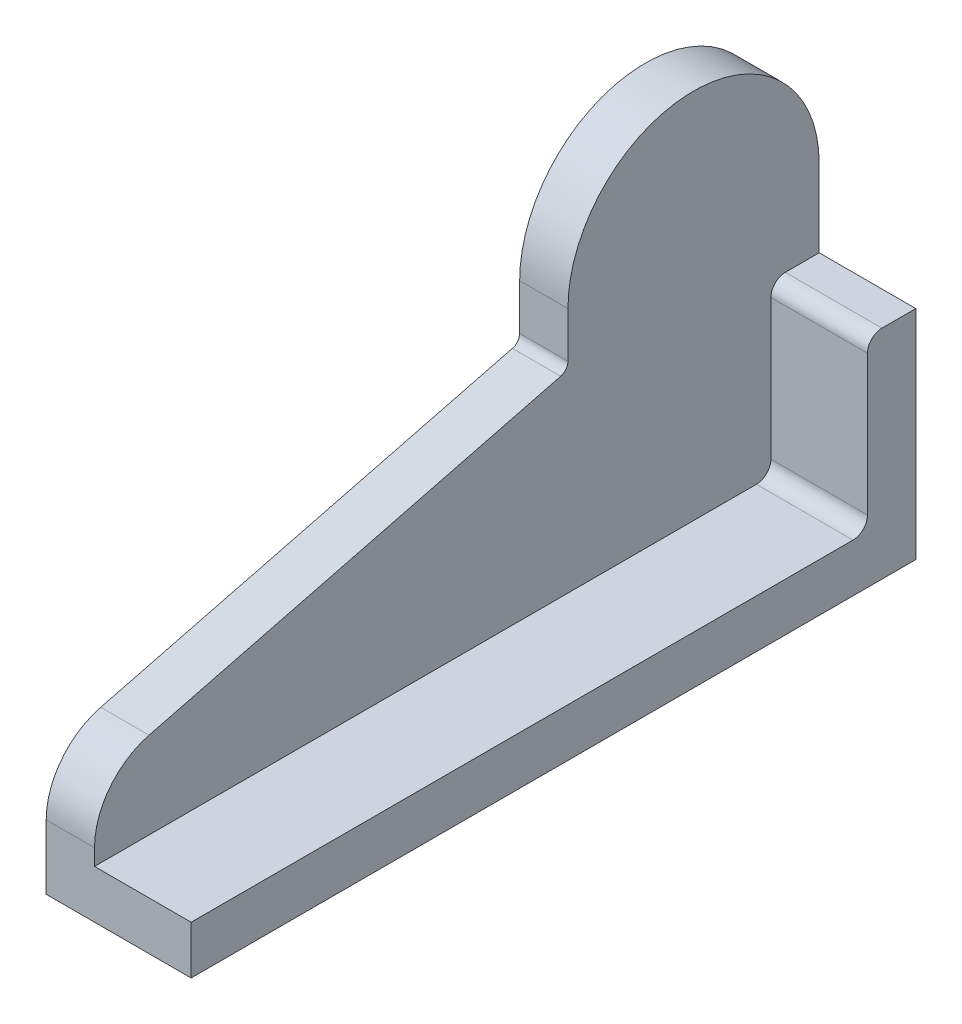
ISO-10303-21;
HEADER;
FILE_DESCRIPTION(('STEP AP214'),'2;1');
FILE_NAME('part.step','',(''),(''),'','','');
FILE_SCHEMA(('AUTOMOTIVE_DESIGN { 1 0 10303 214 1 1 1 1 }'));
ENDSEC;
DATA;
#1=APPLICATION_CONTEXT('core data for automotive mechanical design processes');
#2=APPLICATION_PROTOCOL_DEFINITION('international standard','automotive_design',2000,#1);
#3=PRODUCT_CONTEXT('',#1,'mechanical');
#4=PRODUCT('Part','Part','',(#3));
#5=PRODUCT_RELATED_PRODUCT_CATEGORY('part','',(#4));
#6=PRODUCT_DEFINITION_FORMATION('','',#4);
#7=PRODUCT_DEFINITION_CONTEXT('part definition',#1,'design');
#8=PRODUCT_DEFINITION('design','',#6,#7);
#9=PRODUCT_DEFINITION_SHAPE('','',#8);
#10=(LENGTH_UNIT() NAMED_UNIT(*) SI_UNIT(.MILLI.,.METRE.));
#11=(NAMED_UNIT(*) PLANE_ANGLE_UNIT() SI_UNIT($,.RADIAN.));
#12=(NAMED_UNIT(*) SI_UNIT($,.STERADIAN.) SOLID_ANGLE_UNIT());
#13=UNCERTAINTY_MEASURE_WITH_UNIT(LENGTH_MEASURE(1.E-05),#10,'distance_accuracy_value','');
#14=(GEOMETRIC_REPRESENTATION_CONTEXT(3) GLOBAL_UNCERTAINTY_ASSIGNED_CONTEXT((#13)) GLOBAL_UNIT_ASSIGNED_CONTEXT((#10,
#11,#12)) REPRESENTATION_CONTEXT('',''));
#15=CARTESIAN_POINT('',(0.,0.,0.));
#16=DIRECTION('',(0.,0.,1.));
#17=DIRECTION('',(1.,0.,0.));
#18=AXIS2_PLACEMENT_3D('',#15,#16,#17);
#19=CARTESIAN_POINT('',(-41.,10.,-75.));
#20=DIRECTION('',(0.,0.,1.));
#21=DIRECTION('',(1.,0.,0.));
#22=AXIS2_PLACEMENT_3D('',#19,#20,#21);
#23=PLANE('',#22);
#24=DIRECTION('',(-1.,0.,0.));
#25=VECTOR('',#24,1.);
#26=CARTESIAN_POINT('',(-41.,0.,-75.));
#27=LINE('',#26,#25);
#28=CARTESIAN_POINT('',(10.,0.,-75.));
#29=VERTEX_POINT('',#28);
#30=CARTESIAN_POINT('',(-20.,0.,-75.));
#31=VERTEX_POINT('',#30);
#32=EDGE_CURVE('E170',#29,#31,#27,.T.);
#33=ORIENTED_EDGE('',*,*,#32,.T.);
#34=DIRECTION('',(0.,-1.,0.));
#35=VECTOR('',#34,1.);
#36=CARTESIAN_POINT('',(-20.,45.,-75.));
#37=LINE('',#36,#35);
#38=CARTESIAN_POINT('',(-20.,61.,-75.));
#39=VERTEX_POINT('',#38);
#40=EDGE_CURVE('E160',#39,#31,#37,.T.);
#41=ORIENTED_EDGE('',*,*,#40,.F.);
#42=DIRECTION('',(1.,0.,0.));
#43=VECTOR('',#42,1.);
#44=CARTESIAN_POINT('',(-10.,61.,-75.));
#45=LINE('',#44,#43);
#46=CARTESIAN_POINT('',(-10.,61.,-75.));
#47=VERTEX_POINT('',#46);
#48=EDGE_CURVE('E184',#39,#47,#45,.T.);
#49=ORIENTED_EDGE('',*,*,#48,.T.);
#50=DIRECTION('',(0.,1.,0.));
#51=VECTOR('',#50,1.);
#52=CARTESIAN_POINT('',(-10.,45.,-75.));
#53=LINE('',#52,#51);
#54=CARTESIAN_POINT('',(-10.,45.,-75.));
#55=VERTEX_POINT('',#54);
#56=EDGE_CURVE('E246',#55,#47,#53,.T.);
#57=ORIENTED_EDGE('',*,*,#56,.F.);
#58=DIRECTION('',(1.,0.,0.));
#59=VECTOR('',#58,1.);
#60=CARTESIAN_POINT('',(-41.,45.,-75.));
#61=LINE('',#60,#59);
#62=CARTESIAN_POINT('',(10.,45.,-75.));
#63=VERTEX_POINT('',#62);
#64=EDGE_CURVE('E175',#55,#63,#61,.T.);
#65=ORIENTED_EDGE('',*,*,#64,.T.);
#66=DIRECTION('',(0.,-1.,0.));
#67=VECTOR('',#66,1.);
#68=CARTESIAN_POINT('',(10.,10.,-75.));
#69=LINE('',#68,#67);
#70=EDGE_CURVE('E154',#63,#29,#69,.T.);
#71=ORIENTED_EDGE('',*,*,#70,.T.);
#72=EDGE_LOOP('',(#33,#41,#49,#57,#65,#71));
#73=FACE_BOUND('',#72,.T.);
#74=ADVANCED_FACE('F43',(#73),#23,.F.);
#75=CARTESIAN_POINT('',(-41.,10.,75.));
#76=DIRECTION('',(0.,0.,-1.));
#77=DIRECTION('',(-1.,0.,0.));
#78=AXIS2_PLACEMENT_3D('',#75,#76,#77);
#79=PLANE('',#78);
#80=DIRECTION('',(0.,1.,0.));
#81=VECTOR('',#80,1.);
#82=CARTESIAN_POINT('',(-20.,25.,75.));
#83=LINE('',#82,#81);
#84=CARTESIAN_POINT('',(-20.,0.,75.));
#85=VERTEX_POINT('',#84);
#86=CARTESIAN_POINT('',(-20.,13.3461450703262,75.));
#87=VERTEX_POINT('',#86);
#88=EDGE_CURVE('E143',#85,#87,#83,.T.);
#89=ORIENTED_EDGE('',*,*,#88,.F.);
#90=DIRECTION('',(1.,0.,0.));
#91=VECTOR('',#90,1.);
#92=CARTESIAN_POINT('',(-41.,0.,75.));
#93=LINE('',#92,#91);
#94=CARTESIAN_POINT('',(10.,0.,75.));
#95=VERTEX_POINT('',#94);
#96=EDGE_CURVE('E148',#85,#95,#93,.T.);
#97=ORIENTED_EDGE('',*,*,#96,.T.);
#98=DIRECTION('',(0.,1.,0.));
#99=VECTOR('',#98,1.);
#100=CARTESIAN_POINT('',(10.,10.,75.));
#101=LINE('',#100,#99);
#102=CARTESIAN_POINT('',(10.,10.,75.));
#103=VERTEX_POINT('',#102);
#104=EDGE_CURVE('E164',#95,#103,#101,.T.);
#105=ORIENTED_EDGE('',*,*,#104,.T.);
#106=DIRECTION('',(1.,0.,0.));
#107=VECTOR('',#106,1.);
#108=CARTESIAN_POINT('',(-41.,10.,75.));
#109=LINE('',#108,#107);
#110=CARTESIAN_POINT('',(-9.99999999999998,10.,75.));
#111=VERTEX_POINT('',#110);
#112=EDGE_CURVE('E169',#111,#103,#109,.T.);
#113=ORIENTED_EDGE('',*,*,#112,.F.);
#114=DIRECTION('',(0.,1.,0.));
#115=VECTOR('',#114,1.);
#116=CARTESIAN_POINT('',(-10.,25.,75.));
#117=LINE('',#116,#115);
#118=CARTESIAN_POINT('',(-10.,13.3461450703262,75.));
#119=VERTEX_POINT('',#118);
#120=EDGE_CURVE('E232',#111,#119,#117,.T.);
#121=ORIENTED_EDGE('',*,*,#120,.T.);
#122=DIRECTION('',(-1.,0.,0.));
#123=VECTOR('',#122,1.);
#124=CARTESIAN_POINT('',(-20.,13.3461450703262,75.));
#125=LINE('',#124,#123);
#126=EDGE_CURVE('E152',#119,#87,#125,.T.);
#127=ORIENTED_EDGE('',*,*,#126,.T.);
#128=EDGE_LOOP('',(#89,#97,#105,#113,#121,#127));
#129=FACE_BOUND('',#128,.T.);
#130=ADVANCED_FACE('F145',(#129),#79,.F.);
#131=CARTESIAN_POINT('',(0.,0.,0.));
#132=DIRECTION('',(0.,-1.,0.));
#133=DIRECTION('',(0.,0.,-1.));
#134=AXIS2_PLACEMENT_3D('',#131,#132,#133);
#135=PLANE('',#134);
#136=ORIENTED_EDGE('',*,*,#96,.F.);
#137=DIRECTION('',(0.,0.,-1.));
#138=VECTOR('',#137,1.);
#139=CARTESIAN_POINT('',(-20.,0.,0.));
#140=LINE('',#139,#138);
#141=EDGE_CURVE('E157',#85,#31,#140,.T.);
#142=ORIENTED_EDGE('',*,*,#141,.T.);
#143=ORIENTED_EDGE('',*,*,#32,.F.);
#144=DIRECTION('',(0.,0.,-1.));
#145=VECTOR('',#144,1.);
#146=CARTESIAN_POINT('',(10.,0.,0.));
#147=LINE('',#146,#145);
#148=EDGE_CURVE('E168',#95,#29,#147,.T.);
#149=ORIENTED_EDGE('',*,*,#148,.F.);
#150=EDGE_LOOP('',(#136,#142,#143,#149));
#151=FACE_BOUND('',#150,.T.);
#152=ADVANCED_FACE('F167',(#151),#135,.T.);
#153=CARTESIAN_POINT('',(0.,10.,0.));
#154=DIRECTION('',(0.,-1.,0.));
#155=DIRECTION('',(0.,0.,-1.));
#156=AXIS2_PLACEMENT_3D('',#153,#154,#155);
#157=PLANE('',#156);
#158=DIRECTION('',(0.,0.,1.));
#159=VECTOR('',#158,1.);
#160=CARTESIAN_POINT('',(10.,10.,-75.));
#161=LINE('',#160,#159);
#162=CARTESIAN_POINT('',(10.,10.,-62.));
#163=VERTEX_POINT('',#162);
#164=EDGE_CURVE('E240',#163,#103,#161,.T.);
#165=ORIENTED_EDGE('',*,*,#164,.F.);
#166=DIRECTION('',(-1.,0.,0.));
#167=VECTOR('',#166,1.);
#168=CARTESIAN_POINT('',(0.,10.,-62.));
#169=LINE('',#168,#167);
#170=CARTESIAN_POINT('',(-10.,10.,-62.));
#171=VERTEX_POINT('',#170);
#172=EDGE_CURVE('E209',#163,#171,#169,.T.);
#173=ORIENTED_EDGE('',*,*,#172,.T.);
#174=DIRECTION('',(0.,0.,1.));
#175=VECTOR('',#174,1.);
#176=CARTESIAN_POINT('',(-10.,10.,-75.));
#177=LINE('',#176,#175);
#178=EDGE_CURVE('E238',#171,#111,#177,.T.);
#179=ORIENTED_EDGE('',*,*,#178,.T.);
#180=ORIENTED_EDGE('',*,*,#112,.T.);
#181=EDGE_LOOP('',(#165,#173,#179,#180));
#182=FACE_BOUND('',#181,.T.);
#183=ADVANCED_FACE('F282',(#182),#157,.F.);
#184=CARTESIAN_POINT('',(-10.,61.,-49.));
#185=DIRECTION('',(-1.,0.,0.));
#186=DIRECTION('',(0.,0.,1.));
#187=AXIS2_PLACEMENT_3D('',#184,#185,#186);
#188=CYLINDRICAL_SURFACE('',#187,26.);
#189=DIRECTION('',(1.,0.,0.));
#190=VECTOR('',#189,1.);
#191=CARTESIAN_POINT('',(-10.,61.,-23.));
#192=LINE('',#191,#190);
#193=CARTESIAN_POINT('',(-10.,61.,-23.));
#194=VERTEX_POINT('',#193);
#195=CARTESIAN_POINT('',(-20.,61.,-23.));
#196=VERTEX_POINT('',#195);
#197=EDGE_CURVE('E181',#194,#196,#192,.F.);
#198=ORIENTED_EDGE('',*,*,#197,.F.);
#199=CARTESIAN_POINT('',(-10.,61.,-49.));
#200=DIRECTION('',(1.,0.,0.));
#201=DIRECTION('',(0.,1.,0.));
#202=AXIS2_PLACEMENT_3D('',#199,#200,#201);
#203=CIRCLE('',#202,26.);
#204=EDGE_CURVE('E187',#47,#194,#203,.T.);
#205=ORIENTED_EDGE('',*,*,#204,.F.);
#206=ORIENTED_EDGE('',*,*,#48,.F.);
#207=CARTESIAN_POINT('',(-20.,61.,-49.));
#208=DIRECTION('',(-1.,0.,0.));
#209=DIRECTION('',(0.,-1.,0.));
#210=AXIS2_PLACEMENT_3D('',#207,#208,#209);
#211=CIRCLE('',#210,26.);
#212=EDGE_CURVE('E190',#196,#39,#211,.T.);
#213=ORIENTED_EDGE('',*,*,#212,.F.);
#214=EDGE_LOOP('',(#198,#205,#206,#213));
#215=FACE_BOUND('',#214,.T.);
#216=ADVANCED_FACE('F310',(#215),#188,.T.);
#217=CARTESIAN_POINT('',(-41.,0.,-65.));
#218=DIRECTION('',(0.,0.,1.));
#219=DIRECTION('',(1.,0.,0.));
#220=AXIS2_PLACEMENT_3D('',#217,#218,#219);
#221=PLANE('',#220);
#222=DIRECTION('',(0.,1.,0.));
#223=VECTOR('',#222,1.);
#224=CARTESIAN_POINT('',(-10.,0.,-65.));
#225=LINE('',#224,#223);
#226=CARTESIAN_POINT('',(-10.,13.,-65.));
#227=VERTEX_POINT('',#226);
#228=CARTESIAN_POINT('',(-10.,42.,-65.));
#229=VERTEX_POINT('',#228);
#230=EDGE_CURVE('E242',#227,#229,#225,.T.);
#231=ORIENTED_EDGE('',*,*,#230,.F.);
#232=DIRECTION('',(-1.,0.,0.));
#233=VECTOR('',#232,1.);
#234=CARTESIAN_POINT('',(-41.,13.,-65.));
#235=LINE('',#234,#233);
#236=CARTESIAN_POINT('',(10.,13.,-65.));
#237=VERTEX_POINT('',#236);
#238=EDGE_CURVE('E214',#227,#237,#235,.F.);
#239=ORIENTED_EDGE('',*,*,#238,.T.);
#240=DIRECTION('',(0.,-1.,0.));
#241=VECTOR('',#240,1.);
#242=CARTESIAN_POINT('',(10.,0.,-65.));
#243=LINE('',#242,#241);
#244=CARTESIAN_POINT('',(10.,42.,-65.));
#245=VERTEX_POINT('',#244);
#246=EDGE_CURVE('E253',#245,#237,#243,.T.);
#247=ORIENTED_EDGE('',*,*,#246,.F.);
#248=DIRECTION('',(1.,0.,0.));
#249=VECTOR('',#248,1.);
#250=CARTESIAN_POINT('',(-41.,42.,-65.));
#251=LINE('',#250,#249);
#252=EDGE_CURVE('E202',#245,#229,#251,.F.);
#253=ORIENTED_EDGE('',*,*,#252,.T.);
#254=EDGE_LOOP('',(#231,#239,#247,#253));
#255=FACE_BOUND('',#254,.T.);
#256=ADVANCED_FACE('F275',(#255),#221,.T.);
#257=CARTESIAN_POINT('',(-41.,45.,-75.));
#258=DIRECTION('',(0.,1.,0.));
#259=DIRECTION('',(0.,0.,1.));
#260=AXIS2_PLACEMENT_3D('',#257,#258,#259);
#261=PLANE('',#260);
#262=DIRECTION('',(0.,0.,-1.));
#263=VECTOR('',#262,1.);
#264=CARTESIAN_POINT('',(-10.,45.,-75.));
#265=LINE('',#264,#263);
#266=CARTESIAN_POINT('',(-10.,45.,-68.));
#267=VERTEX_POINT('',#266);
#268=EDGE_CURVE('E173',#267,#55,#265,.T.);
#269=ORIENTED_EDGE('',*,*,#268,.F.);
#270=DIRECTION('',(1.,0.,0.));
#271=VECTOR('',#270,1.);
#272=CARTESIAN_POINT('',(-41.,45.,-68.));
#273=LINE('',#272,#271);
#274=CARTESIAN_POINT('',(10.,45.,-68.));
#275=VERTEX_POINT('',#274);
#276=EDGE_CURVE('E199',#267,#275,#273,.T.);
#277=ORIENTED_EDGE('',*,*,#276,.T.);
#278=DIRECTION('',(0.,0.,1.));
#279=VECTOR('',#278,1.);
#280=CARTESIAN_POINT('',(10.,45.,-75.));
#281=LINE('',#280,#279);
#282=EDGE_CURVE('E179',#63,#275,#281,.T.);
#283=ORIENTED_EDGE('',*,*,#282,.F.);
#284=ORIENTED_EDGE('',*,*,#64,.F.);
#285=EDGE_LOOP('',(#269,#277,#283,#284));
#286=FACE_BOUND('',#285,.T.);
#287=ADVANCED_FACE('F263',(#286),#261,.T.);
#288=CARTESIAN_POINT('',(-20.,45.,-75.));
#289=DIRECTION('',(-1.,0.,0.));
#290=DIRECTION('',(0.,-1.,0.));
#291=AXIS2_PLACEMENT_3D('',#288,#289,#290);
#292=PLANE('',#291);
#293=ORIENTED_EDGE('',*,*,#141,.F.);
#294=ORIENTED_EDGE('',*,*,#88,.T.);
#295=CARTESIAN_POINT('',(-20.,13.3461450703262,60.));
#296=DIRECTION('',(-1.,0.,0.));
#297=DIRECTION('',(0.,-1.,0.));
#298=AXIS2_PLACEMENT_3D('',#295,#296,#297);
#299=CIRCLE('',#298,15.);
#300=CARTESIAN_POINT('',(-20.,27.8806667972386,63.7077861548246));
#301=VERTEX_POINT('',#300);
#302=EDGE_CURVE('E193',#87,#301,#299,.T.);
#303=ORIENTED_EDGE('',*,*,#302,.T.);
#304=DIRECTION('',(0.,0.247185743654974,-0.968968115127499));
#305=VECTOR('',#304,1.);
#306=CARTESIAN_POINT('',(-20.,50.,-23.));
#307=LINE('',#306,#305);
#308=CARTESIAN_POINT('',(-20.,49.6159110937015,-21.4943714873099));
#309=VERTEX_POINT('',#308);
#310=EDGE_CURVE('E153',#301,#309,#307,.T.);
#311=ORIENTED_EDGE('',*,*,#310,.T.);
#312=CARTESIAN_POINT('',(-20.,51.5538473239565,-21.));
#313=DIRECTION('',(-1.,0.,0.));
#314=DIRECTION('',(0.,-1.,0.));
#315=AXIS2_PLACEMENT_3D('',#312,#313,#314);
#316=CIRCLE('',#315,2.);
#317=CARTESIAN_POINT('',(-20.,51.5538473239565,-23.));
#318=VERTEX_POINT('',#317);
#319=EDGE_CURVE('E51',#309,#318,#316,.F.);
#320=ORIENTED_EDGE('',*,*,#319,.T.);
#321=DIRECTION('',(0.,-1.,0.));
#322=VECTOR('',#321,1.);
#323=CARTESIAN_POINT('',(-20.,45.,-23.));
#324=LINE('',#323,#322);
#325=EDGE_CURVE('E249',#196,#318,#324,.T.);
#326=ORIENTED_EDGE('',*,*,#325,.F.);
#327=ORIENTED_EDGE('',*,*,#212,.T.);
#328=ORIENTED_EDGE('',*,*,#40,.T.);
#329=EDGE_LOOP('',(#293,#294,#303,#311,#320,#326,#327,#328));
#330=FACE_BOUND('',#329,.T.);
#331=ADVANCED_FACE('F158',(#330),#292,.T.);
#332=CARTESIAN_POINT('',(-10.,45.,-75.));
#333=DIRECTION('',(1.,0.,0.));
#334=DIRECTION('',(0.,1.,0.));
#335=AXIS2_PLACEMENT_3D('',#332,#333,#334);
#336=PLANE('',#335);
#337=ORIENTED_EDGE('',*,*,#178,.F.);
#338=CARTESIAN_POINT('',(-10.,13.,-62.));
#339=DIRECTION('',(1.,0.,0.));
#340=DIRECTION('',(0.,1.,0.));
#341=AXIS2_PLACEMENT_3D('',#338,#339,#340);
#342=CIRCLE('',#341,3.);
#343=EDGE_CURVE('E212',#171,#227,#342,.T.);
#344=ORIENTED_EDGE('',*,*,#343,.T.);
#345=ORIENTED_EDGE('',*,*,#230,.T.);
#346=CARTESIAN_POINT('',(-10.,42.,-68.));
#347=DIRECTION('',(1.,0.,0.));
#348=DIRECTION('',(0.,1.,0.));
#349=AXIS2_PLACEMENT_3D('',#346,#347,#348);
#350=CIRCLE('',#349,3.);
#351=EDGE_CURVE('E207',#229,#267,#350,.F.);
#352=ORIENTED_EDGE('',*,*,#351,.T.);
#353=ORIENTED_EDGE('',*,*,#268,.T.);
#354=ORIENTED_EDGE('',*,*,#56,.T.);
#355=ORIENTED_EDGE('',*,*,#204,.T.);
#356=DIRECTION('',(0.,1.,0.));
#357=VECTOR('',#356,1.);
#358=CARTESIAN_POINT('',(-10.,45.,-23.));
#359=LINE('',#358,#357);
#360=CARTESIAN_POINT('',(-10.,51.5538473239565,-23.));
#361=VERTEX_POINT('',#360);
#362=EDGE_CURVE('E243',#361,#194,#359,.T.);
#363=ORIENTED_EDGE('',*,*,#362,.F.);
#364=CARTESIAN_POINT('',(-10.,51.5538473239565,-21.));
#365=DIRECTION('',(1.,0.,0.));
#366=DIRECTION('',(0.,1.,0.));
#367=AXIS2_PLACEMENT_3D('',#364,#365,#366);
#368=CIRCLE('',#367,2.);
#369=CARTESIAN_POINT('',(-10.,49.6159110937015,-21.4943714873099));
#370=VERTEX_POINT('',#369);
#371=EDGE_CURVE('E11',#361,#370,#368,.F.);
#372=ORIENTED_EDGE('',*,*,#371,.T.);
#373=DIRECTION('',(0.,0.247185743654974,-0.968968115127499));
#374=VECTOR('',#373,1.);
#375=CARTESIAN_POINT('',(-10.,50.,-23.));
#376=LINE('',#375,#374);
#377=CARTESIAN_POINT('',(-10.,27.8806667972386,63.7077861548246));
#378=VERTEX_POINT('',#377);
#379=EDGE_CURVE('E229',#378,#370,#376,.T.);
#380=ORIENTED_EDGE('',*,*,#379,.F.);
#381=CARTESIAN_POINT('',(-10.,13.3461450703262,60.));
#382=DIRECTION('',(1.,0.,0.));
#383=DIRECTION('',(0.,1.,0.));
#384=AXIS2_PLACEMENT_3D('',#381,#382,#383);
#385=CIRCLE('',#384,15.);
#386=EDGE_CURVE('E197',#378,#119,#385,.T.);
#387=ORIENTED_EDGE('',*,*,#386,.T.);
#388=ORIENTED_EDGE('',*,*,#120,.F.);
#389=EDGE_LOOP('',(#337,#344,#345,#352,#353,#354,#355,#363,#372,#380,#387,#388));
#390=FACE_BOUND('',#389,.T.);
#391=ADVANCED_FACE('F287',(#390),#336,.T.);
#392=CARTESIAN_POINT('',(0.,0.,-23.));
#393=DIRECTION('',(0.,0.,-1.));
#394=DIRECTION('',(-1.,0.,0.));
#395=AXIS2_PLACEMENT_3D('',#392,#393,#394);
#396=PLANE('',#395);
#397=ORIENTED_EDGE('',*,*,#325,.T.);
#398=DIRECTION('',(-1.,0.,0.));
#399=VECTOR('',#398,1.);
#400=CARTESIAN_POINT('',(0.,51.5538473239565,-23.));
#401=LINE('',#400,#399);
#402=EDGE_CURVE('E58',#318,#361,#401,.F.);
#403=ORIENTED_EDGE('',*,*,#402,.T.);
#404=ORIENTED_EDGE('',*,*,#362,.T.);
#405=ORIENTED_EDGE('',*,*,#197,.T.);
#406=EDGE_LOOP('',(#397,#403,#404,#405));
#407=FACE_BOUND('',#406,.T.);
#408=ADVANCED_FACE('F396',(#407),#396,.F.);
#409=CARTESIAN_POINT('',(95.8489489791939,50.,-23.));
#410=DIRECTION('',(0.,0.968968115127499,0.247185743654974));
#411=DIRECTION('',(0.,-0.247185743654974,0.968968115127499));
#412=AXIS2_PLACEMENT_3D('',#409,#410,#411);
#413=PLANE('',#412);
#414=ORIENTED_EDGE('',*,*,#379,.T.);
#415=DIRECTION('',(-1.,0.,0.));
#416=VECTOR('',#415,1.);
#417=CARTESIAN_POINT('',(95.8489489791939,49.6159110937015,-21.4943714873099));
#418=LINE('',#417,#416);
#419=EDGE_CURVE('E219',#370,#309,#418,.T.);
#420=ORIENTED_EDGE('',*,*,#419,.T.);
#421=ORIENTED_EDGE('',*,*,#310,.F.);
#422=DIRECTION('',(-1.,0.,0.));
#423=VECTOR('',#422,1.);
#424=CARTESIAN_POINT('',(-10.,27.8806667972386,63.7077861548246));
#425=LINE('',#424,#423);
#426=EDGE_CURVE('E195',#301,#378,#425,.F.);
#427=ORIENTED_EDGE('',*,*,#426,.T.);
#428=EDGE_LOOP('',(#414,#420,#421,#427));
#429=FACE_BOUND('',#428,.T.);
#430=ADVANCED_FACE('F226',(#429),#413,.T.);
#431=CARTESIAN_POINT('',(-41.,13.3461450703262,60.));
#432=DIRECTION('',(1.,0.,0.));
#433=DIRECTION('',(0.,1.,0.));
#434=AXIS2_PLACEMENT_3D('',#431,#432,#433);
#435=CYLINDRICAL_SURFACE('',#434,15.);
#436=ORIENTED_EDGE('',*,*,#386,.F.);
#437=ORIENTED_EDGE('',*,*,#426,.F.);
#438=ORIENTED_EDGE('',*,*,#302,.F.);
#439=ORIENTED_EDGE('',*,*,#126,.F.);
#440=EDGE_LOOP('',(#436,#437,#438,#439));
#441=FACE_BOUND('',#440,.T.);
#442=ADVANCED_FACE('F292',(#441),#435,.T.);
#443=CARTESIAN_POINT('',(-41.,42.,-68.));
#444=DIRECTION('',(1.,0.,0.));
#445=DIRECTION('',(0.,0.,-1.));
#446=AXIS2_PLACEMENT_3D('',#443,#444,#445);
#447=CYLINDRICAL_SURFACE('',#446,3.);
#448=ORIENTED_EDGE('',*,*,#351,.F.);
#449=ORIENTED_EDGE('',*,*,#252,.F.);
#450=CARTESIAN_POINT('',(10.,42.,-68.));
#451=DIRECTION('',(-1.,0.,0.));
#452=DIRECTION('',(0.,-1.,0.));
#453=AXIS2_PLACEMENT_3D('',#450,#451,#452);
#454=CIRCLE('',#453,3.);
#455=EDGE_CURVE('E205',#275,#245,#454,.F.);
#456=ORIENTED_EDGE('',*,*,#455,.F.);
#457=ORIENTED_EDGE('',*,*,#276,.F.);
#458=EDGE_LOOP('',(#448,#449,#456,#457));
#459=FACE_BOUND('',#458,.T.);
#460=ADVANCED_FACE('F272',(#459),#447,.T.);
#461=CARTESIAN_POINT('',(0.,13.,-62.));
#462=DIRECTION('',(-1.,0.,0.));
#463=DIRECTION('',(0.,0.,1.));
#464=AXIS2_PLACEMENT_3D('',#461,#462,#463);
#465=CYLINDRICAL_SURFACE('',#464,3.);
#466=CARTESIAN_POINT('',(10.,13.,-62.));
#467=DIRECTION('',(-1.,0.,0.));
#468=DIRECTION('',(0.,-1.,0.));
#469=AXIS2_PLACEMENT_3D('',#466,#467,#468);
#470=CIRCLE('',#469,3.);
#471=EDGE_CURVE('E217',#237,#163,#470,.T.);
#472=ORIENTED_EDGE('',*,*,#471,.F.);
#473=ORIENTED_EDGE('',*,*,#238,.F.);
#474=ORIENTED_EDGE('',*,*,#343,.F.);
#475=ORIENTED_EDGE('',*,*,#172,.F.);
#476=EDGE_LOOP('',(#472,#473,#474,#475));
#477=FACE_BOUND('',#476,.T.);
#478=ADVANCED_FACE('F285',(#477),#465,.F.);
#479=CARTESIAN_POINT('',(95.8489489791939,51.5538473239565,-21.));
#480=DIRECTION('',(-1.,0.,0.));
#481=DIRECTION('',(0.,-1.,0.));
#482=AXIS2_PLACEMENT_3D('',#479,#480,#481);
#483=CYLINDRICAL_SURFACE('',#482,2.);
#484=ORIENTED_EDGE('',*,*,#371,.F.);
#485=ORIENTED_EDGE('',*,*,#402,.F.);
#486=ORIENTED_EDGE('',*,*,#319,.F.);
#487=ORIENTED_EDGE('',*,*,#419,.F.);
#488=EDGE_LOOP('',(#484,#485,#486,#487));
#489=FACE_BOUND('',#488,.T.);
#490=ADVANCED_FACE('F45',(#489),#483,.F.);
#491=CARTESIAN_POINT('',(10.,0.,0.));
#492=DIRECTION('',(-1.,0.,0.));
#493=DIRECTION('',(0.,-1.,0.));
#494=AXIS2_PLACEMENT_3D('',#491,#492,#493);
#495=PLANE('',#494);
#496=ORIENTED_EDGE('',*,*,#104,.F.);
#497=ORIENTED_EDGE('',*,*,#148,.T.);
#498=ORIENTED_EDGE('',*,*,#70,.F.);
#499=ORIENTED_EDGE('',*,*,#282,.T.);
#500=ORIENTED_EDGE('',*,*,#455,.T.);
#501=ORIENTED_EDGE('',*,*,#246,.T.);
#502=ORIENTED_EDGE('',*,*,#471,.T.);
#503=ORIENTED_EDGE('',*,*,#164,.T.);
#504=EDGE_LOOP('',(#496,#497,#498,#499,#500,#501,#502,#503));
#505=FACE_BOUND('',#504,.T.);
#506=ADVANCED_FACE('F267',(#505),#495,.F.);
#507=CLOSED_SHELL('',(#74,#130,#152,#183,#216,#256,#287,#331,#391,#408,#430,#442,#460,#478,#490,#506));
#508=MANIFOLD_SOLID_BREP('B2',#507);
#509=ADVANCED_BREP_SHAPE_REPRESENTATION('',(#18,#508),#14);
#510=SHAPE_DEFINITION_REPRESENTATION(#9,#509);
ENDSEC;
END-ISO-10303-21;
